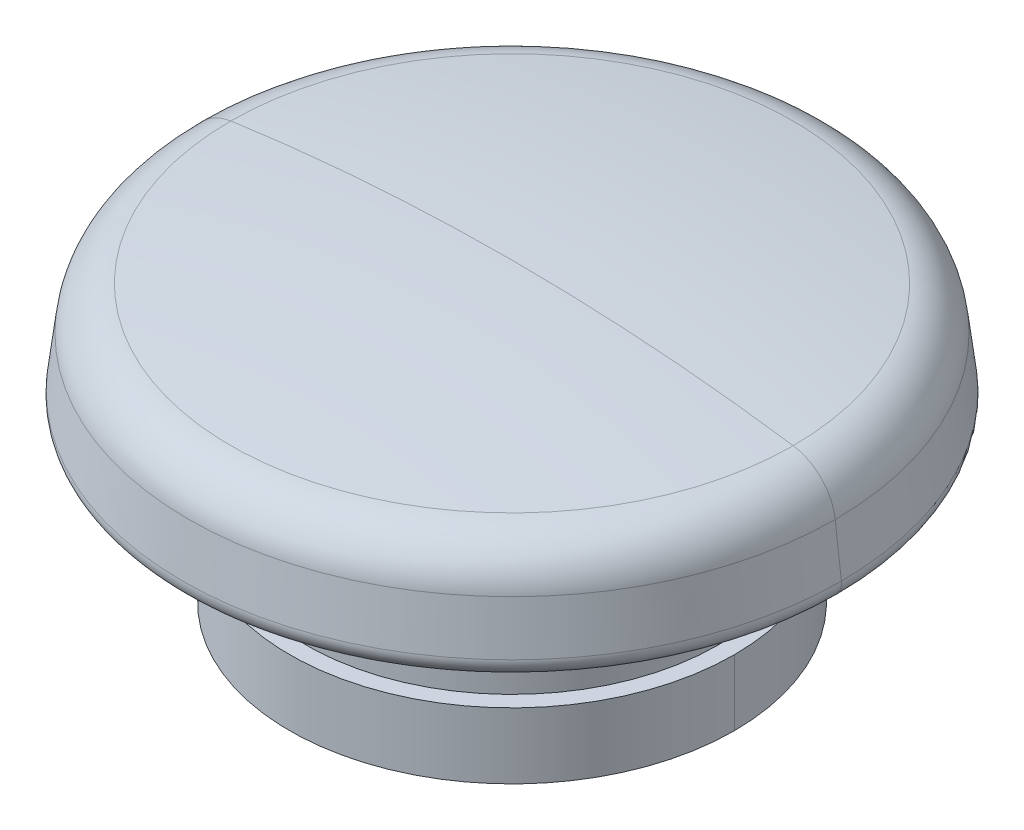
ISO-10303-21;
HEADER;
FILE_DESCRIPTION(('STEP AP214'),'2;1');
FILE_NAME('part.step','',(''),(''),'','','');
FILE_SCHEMA(('AUTOMOTIVE_DESIGN { 1 0 10303 214 1 1 1 1 }'));
ENDSEC;
DATA;
#1=APPLICATION_CONTEXT('core data for automotive mechanical design processes');
#2=APPLICATION_PROTOCOL_DEFINITION('international standard','automotive_design',2000,#1);
#3=PRODUCT_CONTEXT('',#1,'mechanical');
#4=PRODUCT('Part','Part','',(#3));
#5=PRODUCT_RELATED_PRODUCT_CATEGORY('part','',(#4));
#6=PRODUCT_DEFINITION_FORMATION('','',#4);
#7=PRODUCT_DEFINITION_CONTEXT('part definition',#1,'design');
#8=PRODUCT_DEFINITION('design','',#6,#7);
#9=PRODUCT_DEFINITION_SHAPE('','',#8);
#10=(LENGTH_UNIT() NAMED_UNIT(*) SI_UNIT(.MILLI.,.METRE.));
#11=(NAMED_UNIT(*) PLANE_ANGLE_UNIT() SI_UNIT($,.RADIAN.));
#12=(NAMED_UNIT(*) SI_UNIT($,.STERADIAN.) SOLID_ANGLE_UNIT());
#13=UNCERTAINTY_MEASURE_WITH_UNIT(LENGTH_MEASURE(1.E-05),#10,'distance_accuracy_value','');
#14=(GEOMETRIC_REPRESENTATION_CONTEXT(3) GLOBAL_UNCERTAINTY_ASSIGNED_CONTEXT((#13)) GLOBAL_UNIT_ASSIGNED_CONTEXT((#10,
#11,#12)) REPRESENTATION_CONTEXT('',''));
#15=CARTESIAN_POINT('',(0.,0.,0.));
#16=DIRECTION('',(0.,0.,1.));
#17=DIRECTION('',(1.,0.,0.));
#18=AXIS2_PLACEMENT_3D('',#15,#16,#17);
#19=CARTESIAN_POINT('',(0.,-11.2,0.));
#20=DIRECTION('',(0.,-1.,0.));
#21=DIRECTION('',(1.,0.,0.));
#22=AXIS2_PLACEMENT_3D('',#19,#20,#21);
#23=SPHERICAL_SURFACE('',#22,12.);
#24=CARTESIAN_POINT('',(0.,0.677907091357,0.));
#25=DIRECTION('',(0.,1.,0.));
#26=DIRECTION('',(-1.,0.,0.));
#27=AXIS2_PLACEMENT_3D('',#24,#25,#26);
#28=CIRCLE('',#27,1.707431734826);
#29=CARTESIAN_POINT('',(-1.707431734826,0.677907091357,0.));
#30=VERTEX_POINT('',#29);
#31=CARTESIAN_POINT('',(1.707431734826,0.677907091357,0.));
#32=VERTEX_POINT('',#31);
#33=EDGE_CURVE('E205',#30,#32,#28,.T.);
#34=ORIENTED_EDGE('',*,*,#33,.T.);
#35=CARTESIAN_POINT('',(0.,-11.2,0.));
#36=DIRECTION('',(0.,0.,1.));
#37=DIRECTION('',(0.142285977902202,0.989825590946412,0.));
#38=AXIS2_PLACEMENT_3D('',#35,#36,#37);
#39=CIRCLE('',#38,12.);
#40=CARTESIAN_POINT('',(0.,0.8,0.));
#41=VERTEX_POINT('',#40);
#42=EDGE_CURVE('E25',#32,#41,#39,.T.);
#43=ORIENTED_EDGE('',*,*,#42,.T.);
#44=CARTESIAN_POINT('',(0.,-11.2,0.));
#45=DIRECTION('',(0.,0.,-1.));
#46=DIRECTION('',(-0.142285977902202,0.989825590946412,0.));
#47=AXIS2_PLACEMENT_3D('',#44,#45,#46);
#48=CIRCLE('',#47,12.);
#49=EDGE_CURVE('E11',#30,#41,#48,.T.);
#50=ORIENTED_EDGE('',*,*,#49,.F.);
#51=EDGE_LOOP('',(#34,#43,#50));
#52=FACE_BOUND('',#51,.T.);
#53=ADVANCED_FACE('F17',(#52),#23,.T.);
#54=CARTESIAN_POINT('',(0.,-11.2,0.));
#55=DIRECTION('',(0.,-1.,0.));
#56=DIRECTION('',(1.,0.,0.));
#57=AXIS2_PLACEMENT_3D('',#54,#55,#56);
#58=SPHERICAL_SURFACE('',#57,12.);
#59=ORIENTED_EDGE('',*,*,#42,.F.);
#60=CARTESIAN_POINT('',(0.,0.677907091357,0.));
#61=DIRECTION('',(0.,-1.,0.));
#62=DIRECTION('',(-1.,0.,0.));
#63=AXIS2_PLACEMENT_3D('',#60,#61,#62);
#64=CIRCLE('',#63,1.707431734826);
#65=EDGE_CURVE('E212',#30,#32,#64,.T.);
#66=ORIENTED_EDGE('',*,*,#65,.F.);
#67=ORIENTED_EDGE('',*,*,#49,.T.);
#68=EDGE_LOOP('',(#59,#66,#67));
#69=FACE_BOUND('',#68,.T.);
#70=ADVANCED_FACE('F218',(#69),#58,.T.);
#71=CARTESIAN_POINT('',(0.,0.380959414073,0.));
#72=DIRECTION('',(0.,-1.,0.));
#73=DIRECTION('',(1.,0.,0.));
#74=AXIS2_PLACEMENT_3D('',#71,#72,#73);
#75=TOROIDAL_SURFACE('',#74,1.664745941456,0.3);
#76=ORIENTED_EDGE('',*,*,#65,.T.);
#77=CARTESIAN_POINT('',(1.664745941456,0.380959414073,0.));
#78=DIRECTION('',(0.,0.,1.));
#79=DIRECTION('',(0.992546151641328,0.121869343405103,0.));
#80=AXIS2_PLACEMENT_3D('',#77,#78,#79);
#81=CIRCLE('',#80,0.3);
#82=CARTESIAN_POINT('',(1.962509786948,0.4175202170946,0.));
#83=VERTEX_POINT('',#82);
#84=EDGE_CURVE('E201',#83,#32,#81,.T.);
#85=ORIENTED_EDGE('',*,*,#84,.F.);
#86=CARTESIAN_POINT('',(0.,0.4175202170946,0.));
#87=DIRECTION('',(0.,-1.,0.));
#88=DIRECTION('',(-1.,0.,0.));
#89=AXIS2_PLACEMENT_3D('',#86,#87,#88);
#90=CIRCLE('',#89,1.962509786948);
#91=CARTESIAN_POINT('',(-1.962509786948,0.4175202170946,0.));
#92=VERTEX_POINT('',#91);
#93=EDGE_CURVE('E189',#92,#83,#90,.T.);
#94=ORIENTED_EDGE('',*,*,#93,.F.);
#95=CARTESIAN_POINT('',(-1.664745941456,0.380959414073,0.));
#96=DIRECTION('',(0.,0.,-1.));
#97=DIRECTION('',(-0.992546151641328,0.121869343405103,0.));
#98=AXIS2_PLACEMENT_3D('',#95,#96,#97);
#99=CIRCLE('',#98,0.3);
#100=EDGE_CURVE('E208',#92,#30,#99,.T.);
#101=ORIENTED_EDGE('',*,*,#100,.T.);
#102=EDGE_LOOP('',(#76,#85,#94,#101));
#103=FACE_BOUND('',#102,.T.);
#104=ADVANCED_FACE('F220',(#103),#75,.T.);
#105=CARTESIAN_POINT('',(0.,0.380959414073,0.));
#106=DIRECTION('',(0.,-1.,0.));
#107=DIRECTION('',(1.,0.,0.));
#108=AXIS2_PLACEMENT_3D('',#105,#106,#107);
#109=TOROIDAL_SURFACE('',#108,1.664745941456,0.3);
#110=CARTESIAN_POINT('',(0.,0.4175202170946,0.));
#111=DIRECTION('',(0.,1.,0.));
#112=DIRECTION('',(-1.,0.,0.));
#113=AXIS2_PLACEMENT_3D('',#110,#111,#112);
#114=CIRCLE('',#113,1.962509786948);
#115=EDGE_CURVE('E146',#92,#83,#114,.T.);
#116=ORIENTED_EDGE('',*,*,#115,.T.);
#117=ORIENTED_EDGE('',*,*,#84,.T.);
#118=ORIENTED_EDGE('',*,*,#33,.F.);
#119=ORIENTED_EDGE('',*,*,#100,.F.);
#120=EDGE_LOOP('',(#116,#117,#118,#119));
#121=FACE_BOUND('',#120,.T.);
#122=ADVANCED_FACE('F225',(#121),#109,.T.);
#123=CARTESIAN_POINT('',(0.,0.2648535757176,0.));
#124=DIRECTION('',(0.,-1.,0.));
#125=DIRECTION('',(1.,0.,0.));
#126=AXIS2_PLACEMENT_3D('',#123,#124,#125);
#127=CONICAL_SURFACE('',#126,1.981254893474,0.12217304763958);
#128=CARTESIAN_POINT('',(0.,0.1121869343405,0.));
#129=DIRECTION('',(0.,1.,0.));
#130=DIRECTION('',(-1.,0.,0.));
#131=AXIS2_PLACEMENT_3D('',#128,#129,#130);
#132=CIRCLE('',#131,2.);
#133=CARTESIAN_POINT('',(-2.,0.1121869343405,0.));
#134=VERTEX_POINT('',#133);
#135=CARTESIAN_POINT('',(2.,0.1121869343405,0.));
#136=VERTEX_POINT('',#135);
#137=EDGE_CURVE('E177',#134,#136,#132,.T.);
#138=ORIENTED_EDGE('',*,*,#137,.T.);
#139=DIRECTION('',(-0.121869343405103,0.992546151641327,0.));
#140=VECTOR('',#139,1.);
#141=CARTESIAN_POINT('',(2.,0.1121869343405,0.));
#142=LINE('',#141,#140);
#143=EDGE_CURVE('E193',#136,#83,#142,.T.);
#144=ORIENTED_EDGE('',*,*,#143,.T.);
#145=ORIENTED_EDGE('',*,*,#115,.F.);
#146=DIRECTION('',(0.121869343405103,0.992546151641327,0.));
#147=VECTOR('',#146,1.);
#148=CARTESIAN_POINT('',(-2.,0.1121869343405,0.));
#149=LINE('',#148,#147);
#150=EDGE_CURVE('E197',#134,#92,#149,.T.);
#151=ORIENTED_EDGE('',*,*,#150,.F.);
#152=EDGE_LOOP('',(#138,#144,#145,#151));
#153=FACE_BOUND('',#152,.T.);
#154=ADVANCED_FACE('F227',(#153),#127,.T.);
#155=CARTESIAN_POINT('',(0.,0.2648535757176,0.));
#156=DIRECTION('',(0.,-1.,0.));
#157=DIRECTION('',(1.,0.,0.));
#158=AXIS2_PLACEMENT_3D('',#155,#156,#157);
#159=CONICAL_SURFACE('',#158,1.981254893474,0.12217304763958);
#160=ORIENTED_EDGE('',*,*,#93,.T.);
#161=ORIENTED_EDGE('',*,*,#143,.F.);
#162=CARTESIAN_POINT('',(0.,0.1121869343405,0.));
#163=DIRECTION('',(0.,-1.,0.));
#164=DIRECTION('',(-1.,0.,0.));
#165=AXIS2_PLACEMENT_3D('',#162,#163,#164);
#166=CIRCLE('',#165,2.);
#167=EDGE_CURVE('E182',#134,#136,#166,.T.);
#168=ORIENTED_EDGE('',*,*,#167,.F.);
#169=ORIENTED_EDGE('',*,*,#150,.T.);
#170=EDGE_LOOP('',(#160,#161,#168,#169));
#171=FACE_BOUND('',#170,.T.);
#172=ADVANCED_FACE('F231',(#171),#159,.T.);
#173=CARTESIAN_POINT('',(0.,0.1,0.));
#174=DIRECTION('',(0.,-1.,0.));
#175=DIRECTION('',(1.,0.,0.));
#176=AXIS2_PLACEMENT_3D('',#173,#174,#175);
#177=TOROIDAL_SURFACE('',#176,1.900745384836,0.1);
#178=ORIENTED_EDGE('',*,*,#167,.T.);
#179=CARTESIAN_POINT('',(1.900745384836,0.1,0.));
#180=DIRECTION('',(0.,0.,1.));
#181=DIRECTION('',(0.,-1.,0.));
#182=AXIS2_PLACEMENT_3D('',#179,#180,#181);
#183=CIRCLE('',#182,0.1);
#184=CARTESIAN_POINT('',(1.900745384836,0.,0.));
#185=VERTEX_POINT('',#184);
#186=EDGE_CURVE('E173',#185,#136,#183,.T.);
#187=ORIENTED_EDGE('',*,*,#186,.F.);
#188=CARTESIAN_POINT('',(0.,0.,0.));
#189=DIRECTION('',(0.,-1.,0.));
#190=DIRECTION('',(-1.,0.,0.));
#191=AXIS2_PLACEMENT_3D('',#188,#189,#190);
#192=CIRCLE('',#191,1.900745384836);
#193=CARTESIAN_POINT('',(-1.900745384836,0.,0.));
#194=VERTEX_POINT('',#193);
#195=EDGE_CURVE('E150',#194,#185,#192,.T.);
#196=ORIENTED_EDGE('',*,*,#195,.F.);
#197=CARTESIAN_POINT('',(-1.900745384836,0.1,0.));
#198=DIRECTION('',(0.,0.,-1.));
#199=DIRECTION('',(0.,-1.,0.));
#200=AXIS2_PLACEMENT_3D('',#197,#198,#199);
#201=CIRCLE('',#200,0.1);
#202=EDGE_CURVE('E178',#194,#134,#201,.T.);
#203=ORIENTED_EDGE('',*,*,#202,.T.);
#204=EDGE_LOOP('',(#178,#187,#196,#203));
#205=FACE_BOUND('',#204,.T.);
#206=ADVANCED_FACE('F234',(#205),#177,.T.);
#207=CARTESIAN_POINT('',(0.,0.1,0.));
#208=DIRECTION('',(0.,-1.,0.));
#209=DIRECTION('',(1.,0.,0.));
#210=AXIS2_PLACEMENT_3D('',#207,#208,#209);
#211=TOROIDAL_SURFACE('',#210,1.900745384836,0.1);
#212=CARTESIAN_POINT('',(0.,0.,0.));
#213=DIRECTION('',(0.,1.,0.));
#214=DIRECTION('',(-1.,0.,0.));
#215=AXIS2_PLACEMENT_3D('',#212,#213,#214);
#216=CIRCLE('',#215,1.900745384836);
#217=EDGE_CURVE('E169',#194,#185,#216,.T.);
#218=ORIENTED_EDGE('',*,*,#217,.T.);
#219=ORIENTED_EDGE('',*,*,#186,.T.);
#220=ORIENTED_EDGE('',*,*,#137,.F.);
#221=ORIENTED_EDGE('',*,*,#202,.F.);
#222=EDGE_LOOP('',(#218,#219,#220,#221));
#223=FACE_BOUND('',#222,.T.);
#224=ADVANCED_FACE('F237',(#223),#211,.T.);
#225=CARTESIAN_POINT('',(0.,0.,0.));
#226=DIRECTION('',(0.,-1.,0.));
#227=DIRECTION('',(0.,0.,-1.));
#228=AXIS2_PLACEMENT_3D('',#225,#226,#227);
#229=PLANE('',#228);
#230=CARTESIAN_POINT('',(0.,0.,0.));
#231=DIRECTION('',(0.,1.,0.));
#232=DIRECTION('',(-1.,0.,0.));
#233=AXIS2_PLACEMENT_3D('',#230,#231,#232);
#234=CIRCLE('',#233,1.35);
#235=CARTESIAN_POINT('',(-1.35,0.,0.));
#236=VERTEX_POINT('',#235);
#237=CARTESIAN_POINT('',(1.35,0.,0.));
#238=VERTEX_POINT('',#237);
#239=EDGE_CURVE('E159',#236,#238,#234,.T.);
#240=ORIENTED_EDGE('',*,*,#239,.T.);
#241=CARTESIAN_POINT('',(0.,0.,0.));
#242=DIRECTION('',(0.,-1.,0.));
#243=DIRECTION('',(-1.,0.,0.));
#244=AXIS2_PLACEMENT_3D('',#241,#242,#243);
#245=CIRCLE('',#244,1.35);
#246=EDGE_CURVE('E148',#236,#238,#245,.T.);
#247=ORIENTED_EDGE('',*,*,#246,.F.);
#248=EDGE_LOOP('',(#240,#247));
#249=FACE_BOUND('',#248,.T.);
#250=ORIENTED_EDGE('',*,*,#195,.T.);
#251=ORIENTED_EDGE('',*,*,#217,.F.);
#252=EDGE_LOOP('',(#250,#251));
#253=FACE_BOUND('',#252,.T.);
#254=ADVANCED_FACE('F239',(#249,#253),#229,.T.);
#255=CARTESIAN_POINT('',(0.,-0.1,0.));
#256=DIRECTION('',(0.,-1.,0.));
#257=DIRECTION('',(1.,0.,0.));
#258=AXIS2_PLACEMENT_3D('',#255,#256,#257);
#259=TOROIDAL_SURFACE('',#258,1.35,0.1);
#260=ORIENTED_EDGE('',*,*,#246,.T.);
#261=CARTESIAN_POINT('',(1.35,-0.1,0.));
#262=DIRECTION('',(0.,0.,-1.));
#263=DIRECTION('',(-1.,0.,0.));
#264=AXIS2_PLACEMENT_3D('',#261,#262,#263);
#265=CIRCLE('',#264,0.1);
#266=CARTESIAN_POINT('',(1.25,-0.1,0.));
#267=VERTEX_POINT('',#266);
#268=EDGE_CURVE('E155',#267,#238,#265,.T.);
#269=ORIENTED_EDGE('',*,*,#268,.F.);
#270=CARTESIAN_POINT('',(0.,-0.1,0.));
#271=DIRECTION('',(0.,-1.,0.));
#272=DIRECTION('',(-1.,0.,0.));
#273=AXIS2_PLACEMENT_3D('',#270,#271,#272);
#274=CIRCLE('',#273,1.25);
#275=CARTESIAN_POINT('',(-1.25,-0.1,0.));
#276=VERTEX_POINT('',#275);
#277=EDGE_CURVE('E295',#276,#267,#274,.T.);
#278=ORIENTED_EDGE('',*,*,#277,.F.);
#279=CARTESIAN_POINT('',(-1.35,-0.1,0.));
#280=DIRECTION('',(0.,0.,1.));
#281=DIRECTION('',(1.,0.,0.));
#282=AXIS2_PLACEMENT_3D('',#279,#280,#281);
#283=CIRCLE('',#282,0.1);
#284=EDGE_CURVE('E151',#276,#236,#283,.T.);
#285=ORIENTED_EDGE('',*,*,#284,.T.);
#286=EDGE_LOOP('',(#260,#269,#278,#285));
#287=FACE_BOUND('',#286,.T.);
#288=ADVANCED_FACE('F241',(#287),#259,.F.);
#289=CARTESIAN_POINT('',(0.,-0.1,0.));
#290=DIRECTION('',(0.,-1.,0.));
#291=DIRECTION('',(1.,0.,0.));
#292=AXIS2_PLACEMENT_3D('',#289,#290,#291);
#293=TOROIDAL_SURFACE('',#292,1.35,0.1);
#294=CARTESIAN_POINT('',(0.,-0.1,0.));
#295=DIRECTION('',(0.,1.,0.));
#296=DIRECTION('',(-1.,0.,0.));
#297=AXIS2_PLACEMENT_3D('',#294,#295,#296);
#298=CIRCLE('',#297,1.25);
#299=EDGE_CURVE('E133',#276,#267,#298,.T.);
#300=ORIENTED_EDGE('',*,*,#299,.T.);
#301=ORIENTED_EDGE('',*,*,#268,.T.);
#302=ORIENTED_EDGE('',*,*,#239,.F.);
#303=ORIENTED_EDGE('',*,*,#284,.F.);
#304=EDGE_LOOP('',(#300,#301,#302,#303));
#305=FACE_BOUND('',#304,.T.);
#306=ADVANCED_FACE('F250',(#305),#293,.F.);
#307=CARTESIAN_POINT('',(0.,0.87,0.));
#308=DIRECTION('',(0.,-1.,0.));
#309=DIRECTION('',(1.,0.,0.));
#310=AXIS2_PLACEMENT_3D('',#307,#308,#309);
#311=CYLINDRICAL_SURFACE('',#310,1.25);
#312=DIRECTION('',(0.,1.,0.));
#313=VECTOR('',#312,1.);
#314=CARTESIAN_POINT('',(1.25,-0.6,0.));
#315=LINE('',#314,#313);
#316=CARTESIAN_POINT('',(1.25,-0.6,0.));
#317=VERTEX_POINT('',#316);
#318=EDGE_CURVE('E285',#317,#267,#315,.T.);
#319=ORIENTED_EDGE('',*,*,#318,.T.);
#320=ORIENTED_EDGE('',*,*,#299,.F.);
#321=DIRECTION('',(0.,1.,0.));
#322=VECTOR('',#321,1.);
#323=CARTESIAN_POINT('',(-1.25,-0.6,0.));
#324=LINE('',#323,#322);
#325=CARTESIAN_POINT('',(-1.25,-0.6,0.));
#326=VERTEX_POINT('',#325);
#327=EDGE_CURVE('E299',#326,#276,#324,.T.);
#328=ORIENTED_EDGE('',*,*,#327,.F.);
#329=CARTESIAN_POINT('',(0.,-0.6,0.));
#330=DIRECTION('',(0.,-1.,0.));
#331=DIRECTION('',(1.,0.,0.));
#332=AXIS2_PLACEMENT_3D('',#329,#330,#331);
#333=CIRCLE('',#332,1.25);
#334=EDGE_CURVE('E289',#317,#326,#333,.T.);
#335=ORIENTED_EDGE('',*,*,#334,.F.);
#336=EDGE_LOOP('',(#319,#320,#328,#335));
#337=FACE_BOUND('',#336,.T.);
#338=ADVANCED_FACE('F274',(#337),#311,.T.);
#339=CARTESIAN_POINT('',(0.,-0.657,0.));
#340=DIRECTION('',(0.,-1.,0.));
#341=DIRECTION('',(0.,0.,1.));
#342=AXIS2_PLACEMENT_3D('',#339,#340,#341);
#343=CONICAL_SURFACE('',#342,0.5098488384069,0.9599310885967);
#344=DIRECTION('',(0.,-0.573576436351011,0.819152044289016));
#345=VECTOR('',#344,1.);
#346=CARTESIAN_POINT('',(0.,-0.3,0.));
#347=LINE('',#346,#345);
#348=CARTESIAN_POINT('',(0.,-0.3,0.));
#349=VERTEX_POINT('',#348);
#350=CARTESIAN_POINT('',(0.,-1.,0.9997036047195));
#351=VERTEX_POINT('',#350);
#352=EDGE_CURVE('E123',#349,#351,#347,.T.);
#353=ORIENTED_EDGE('',*,*,#352,.F.);
#354=DIRECTION('',(0.,-0.573576436351011,-0.819152044289016));
#355=VECTOR('',#354,1.);
#356=CARTESIAN_POINT('',(0.,-0.3,0.));
#357=LINE('',#356,#355);
#358=CARTESIAN_POINT('',(0.,-1.,-0.9997036047195));
#359=VERTEX_POINT('',#358);
#360=EDGE_CURVE('E126',#349,#359,#357,.T.);
#361=ORIENTED_EDGE('',*,*,#360,.T.);
#362=CARTESIAN_POINT('',(0.,-1.,0.));
#363=DIRECTION('',(0.,-1.,0.));
#364=DIRECTION('',(0.,0.,-1.));
#365=AXIS2_PLACEMENT_3D('',#362,#363,#364);
#366=CIRCLE('',#365,0.9997036047195);
#367=EDGE_CURVE('E129',#359,#351,#366,.T.);
#368=ORIENTED_EDGE('',*,*,#367,.T.);
#369=EDGE_LOOP('',(#353,#361,#368));
#370=FACE_BOUND('',#369,.T.);
#371=ADVANCED_FACE('F125',(#370),#343,.F.);
#372=CARTESIAN_POINT('',(0.,-0.657,0.));
#373=DIRECTION('',(0.,-1.,0.));
#374=DIRECTION('',(0.,0.,1.));
#375=AXIS2_PLACEMENT_3D('',#372,#373,#374);
#376=CONICAL_SURFACE('',#375,0.5098488384069,0.9599310885967);
#377=ORIENTED_EDGE('',*,*,#360,.F.);
#378=ORIENTED_EDGE('',*,*,#352,.T.);
#379=CARTESIAN_POINT('',(0.,-1.,0.));
#380=DIRECTION('',(0.,-1.,0.));
#381=DIRECTION('',(0.,0.,1.));
#382=AXIS2_PLACEMENT_3D('',#379,#380,#381);
#383=CIRCLE('',#382,0.9997036047195);
#384=EDGE_CURVE('E136',#351,#359,#383,.T.);
#385=ORIENTED_EDGE('',*,*,#384,.T.);
#386=EDGE_LOOP('',(#377,#378,#385));
#387=FACE_BOUND('',#386,.T.);
#388=ADVANCED_FACE('F135',(#387),#376,.F.);
#389=CARTESIAN_POINT('',(0.,-1.,0.));
#390=DIRECTION('',(0.,-1.,0.));
#391=DIRECTION('',(0.,0.,-1.));
#392=AXIS2_PLACEMENT_3D('',#389,#390,#391);
#393=PLANE('',#392);
#394=ORIENTED_EDGE('',*,*,#367,.F.);
#395=ORIENTED_EDGE('',*,*,#384,.F.);
#396=EDGE_LOOP('',(#394,#395));
#397=FACE_BOUND('',#396,.T.);
#398=CARTESIAN_POINT('',(0.,-1.,0.));
#399=DIRECTION('',(0.,-1.,0.));
#400=DIRECTION('',(-1.,0.,0.));
#401=AXIS2_PLACEMENT_3D('',#398,#399,#400);
#402=CIRCLE('',#401,1.35);
#403=CARTESIAN_POINT('',(-1.35,-1.,0.));
#404=VERTEX_POINT('',#403);
#405=CARTESIAN_POINT('',(1.35,-1.,0.));
#406=VERTEX_POINT('',#405);
#407=EDGE_CURVE('E325',#404,#406,#402,.T.);
#408=ORIENTED_EDGE('',*,*,#407,.T.);
#409=CARTESIAN_POINT('',(0.,-1.,0.));
#410=DIRECTION('',(0.,-1.,0.));
#411=DIRECTION('',(1.,0.,0.));
#412=AXIS2_PLACEMENT_3D('',#409,#410,#411);
#413=CIRCLE('',#412,1.35);
#414=EDGE_CURVE('E313',#406,#404,#413,.T.);
#415=ORIENTED_EDGE('',*,*,#414,.T.);
#416=EDGE_LOOP('',(#408,#415));
#417=FACE_BOUND('',#416,.T.);
#418=ADVANCED_FACE('F335',(#397,#417),#393,.T.);
#419=CARTESIAN_POINT('',(0.,-0.6,0.));
#420=DIRECTION('',(0.,-1.,0.));
#421=DIRECTION('',(1.,0.,0.));
#422=AXIS2_PLACEMENT_3D('',#419,#420,#421);
#423=CYLINDRICAL_SURFACE('',#422,1.35);
#424=DIRECTION('',(0.,-1.,0.));
#425=VECTOR('',#424,1.);
#426=CARTESIAN_POINT('',(1.35,-0.6,0.));
#427=LINE('',#426,#425);
#428=CARTESIAN_POINT('',(1.35,-0.6,0.));
#429=VERTEX_POINT('',#428);
#430=EDGE_CURVE('E317',#429,#406,#427,.T.);
#431=ORIENTED_EDGE('',*,*,#430,.T.);
#432=ORIENTED_EDGE('',*,*,#407,.F.);
#433=DIRECTION('',(0.,-1.,0.));
#434=VECTOR('',#433,1.);
#435=CARTESIAN_POINT('',(-1.35,-0.6,0.));
#436=LINE('',#435,#434);
#437=CARTESIAN_POINT('',(-1.35,-0.6,0.));
#438=VERTEX_POINT('',#437);
#439=EDGE_CURVE('E318',#438,#404,#436,.T.);
#440=ORIENTED_EDGE('',*,*,#439,.F.);
#441=CARTESIAN_POINT('',(0.,-0.6,0.));
#442=DIRECTION('',(0.,-1.,0.));
#443=DIRECTION('',(-1.,0.,0.));
#444=AXIS2_PLACEMENT_3D('',#441,#442,#443);
#445=CIRCLE('',#444,1.35);
#446=EDGE_CURVE('E308',#438,#429,#445,.T.);
#447=ORIENTED_EDGE('',*,*,#446,.T.);
#448=EDGE_LOOP('',(#431,#432,#440,#447));
#449=FACE_BOUND('',#448,.T.);
#450=ADVANCED_FACE('F338',(#449),#423,.T.);
#451=CARTESIAN_POINT('',(0.,-0.6,0.));
#452=DIRECTION('',(0.,-1.,0.));
#453=DIRECTION('',(1.,0.,0.));
#454=AXIS2_PLACEMENT_3D('',#451,#452,#453);
#455=CYLINDRICAL_SURFACE('',#454,1.35);
#456=ORIENTED_EDGE('',*,*,#439,.T.);
#457=ORIENTED_EDGE('',*,*,#414,.F.);
#458=ORIENTED_EDGE('',*,*,#430,.F.);
#459=CARTESIAN_POINT('',(0.,-0.6,0.));
#460=DIRECTION('',(0.,-1.,0.));
#461=DIRECTION('',(1.,0.,0.));
#462=AXIS2_PLACEMENT_3D('',#459,#460,#461);
#463=CIRCLE('',#462,1.35);
#464=EDGE_CURVE('E312',#429,#438,#463,.T.);
#465=ORIENTED_EDGE('',*,*,#464,.T.);
#466=EDGE_LOOP('',(#456,#457,#458,#465));
#467=FACE_BOUND('',#466,.T.);
#468=ADVANCED_FACE('F342',(#467),#455,.T.);
#469=CARTESIAN_POINT('',(0.,-0.6,0.));
#470=DIRECTION('',(0.,-1.,0.));
#471=DIRECTION('',(0.,0.,-1.));
#472=AXIS2_PLACEMENT_3D('',#469,#470,#471);
#473=PLANE('',#472);
#474=ORIENTED_EDGE('',*,*,#334,.T.);
#475=CARTESIAN_POINT('',(0.,-0.6,0.));
#476=DIRECTION('',(0.,-1.,0.));
#477=DIRECTION('',(-1.,0.,0.));
#478=AXIS2_PLACEMENT_3D('',#475,#476,#477);
#479=CIRCLE('',#478,1.25);
#480=EDGE_CURVE('E294',#326,#317,#479,.T.);
#481=ORIENTED_EDGE('',*,*,#480,.T.);
#482=EDGE_LOOP('',(#474,#481));
#483=FACE_BOUND('',#482,.T.);
#484=ORIENTED_EDGE('',*,*,#446,.F.);
#485=ORIENTED_EDGE('',*,*,#464,.F.);
#486=EDGE_LOOP('',(#484,#485));
#487=FACE_BOUND('',#486,.T.);
#488=ADVANCED_FACE('F344',(#483,#487),#473,.F.);
#489=CARTESIAN_POINT('',(0.,0.87,0.));
#490=DIRECTION('',(0.,-1.,0.));
#491=DIRECTION('',(1.,0.,0.));
#492=AXIS2_PLACEMENT_3D('',#489,#490,#491);
#493=CYLINDRICAL_SURFACE('',#492,1.25);
#494=ORIENTED_EDGE('',*,*,#327,.T.);
#495=ORIENTED_EDGE('',*,*,#277,.T.);
#496=ORIENTED_EDGE('',*,*,#318,.F.);
#497=ORIENTED_EDGE('',*,*,#480,.F.);
#498=EDGE_LOOP('',(#494,#495,#496,#497));
#499=FACE_BOUND('',#498,.T.);
#500=ADVANCED_FACE('F298',(#499),#493,.T.);
#501=CLOSED_SHELL('',(#53,#70,#104,#122,#154,#172,#206,#224,#254,#288,#306,#338,#371,#388,#418,
#450,#468,#488,#500));
#502=MANIFOLD_SOLID_BREP('B1',#501);
#503=ADVANCED_BREP_SHAPE_REPRESENTATION('',(#18,#502),#14);
#504=SHAPE_DEFINITION_REPRESENTATION(#9,#503);
ENDSEC;
END-ISO-10303-21;
